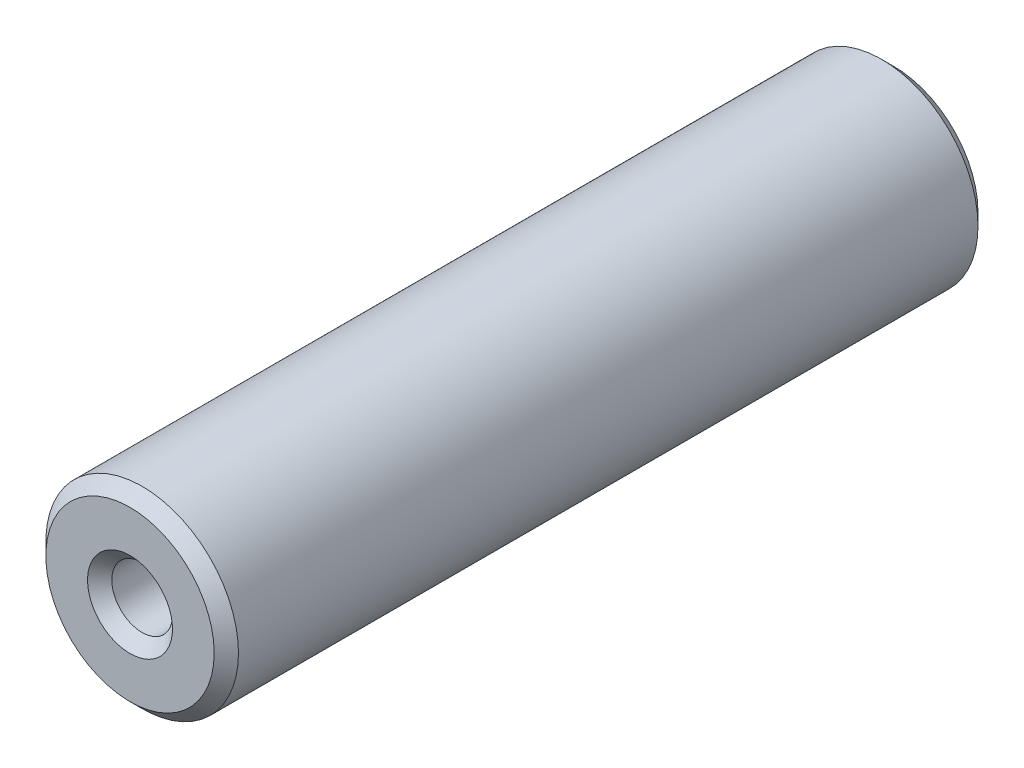
ISO-10303-21;
HEADER;
FILE_DESCRIPTION(('STEP AP214'),'2;1');
FILE_NAME('part.step','',(''),(''),'','','');
FILE_SCHEMA(('AUTOMOTIVE_DESIGN { 1 0 10303 214 1 1 1 1 }'));
ENDSEC;
DATA;
#1=APPLICATION_CONTEXT('core data for automotive mechanical design processes');
#2=APPLICATION_PROTOCOL_DEFINITION('international standard','automotive_design',2000,#1);
#3=PRODUCT_CONTEXT('',#1,'mechanical');
#4=PRODUCT('Part','Part','',(#3));
#5=PRODUCT_RELATED_PRODUCT_CATEGORY('part','',(#4));
#6=PRODUCT_DEFINITION_FORMATION('','',#4);
#7=PRODUCT_DEFINITION_CONTEXT('part definition',#1,'design');
#8=PRODUCT_DEFINITION('design','',#6,#7);
#9=PRODUCT_DEFINITION_SHAPE('','',#8);
#10=(LENGTH_UNIT() NAMED_UNIT(*) SI_UNIT(.MILLI.,.METRE.));
#11=(NAMED_UNIT(*) PLANE_ANGLE_UNIT() SI_UNIT($,.RADIAN.));
#12=(NAMED_UNIT(*) SI_UNIT($,.STERADIAN.) SOLID_ANGLE_UNIT());
#13=UNCERTAINTY_MEASURE_WITH_UNIT(LENGTH_MEASURE(1.E-05),#10,'distance_accuracy_value','');
#14=(GEOMETRIC_REPRESENTATION_CONTEXT(3) GLOBAL_UNCERTAINTY_ASSIGNED_CONTEXT((#13)) GLOBAL_UNIT_ASSIGNED_CONTEXT((#10,
#11,#12)) REPRESENTATION_CONTEXT('',''));
#15=CARTESIAN_POINT('',(0.,0.,0.));
#16=DIRECTION('',(0.,0.,1.));
#17=DIRECTION('',(1.,0.,0.));
#18=AXIS2_PLACEMENT_3D('',#15,#16,#17);
#19=CARTESIAN_POINT('',(0.,0.,31.475));
#20=DIRECTION('',(0.,0.,-1.));
#21=DIRECTION('',(-1.,0.,0.));
#22=AXIS2_PLACEMENT_3D('',#19,#20,#21);
#23=CYLINDRICAL_SURFACE('',#22,3.96875);
#24=CARTESIAN_POINT('',(0.,0.,0.500000000000004));
#25=DIRECTION('',(0.,0.,1.));
#26=DIRECTION('',(1.,0.,0.));
#27=AXIS2_PLACEMENT_3D('',#24,#25,#26);
#28=CIRCLE('',#27,3.96875);
#29=CARTESIAN_POINT('',(3.96875,0.,0.500000000000004));
#30=VERTEX_POINT('',#29);
#31=EDGE_CURVE('E45',#30,#30,#28,.T.);
#32=ORIENTED_EDGE('',*,*,#31,.T.);
#33=EDGE_LOOP('',(#32));
#34=FACE_BOUND('',#33,.T.);
#35=CARTESIAN_POINT('',(0.,0.,30.975));
#36=DIRECTION('',(0.,0.,1.));
#37=DIRECTION('',(1.,0.,0.));
#38=AXIS2_PLACEMENT_3D('',#35,#36,#37);
#39=CIRCLE('',#38,3.96875);
#40=CARTESIAN_POINT('',(3.96875,0.,30.975));
#41=VERTEX_POINT('',#40);
#42=EDGE_CURVE('E50',#41,#41,#39,.F.);
#43=ORIENTED_EDGE('',*,*,#42,.T.);
#44=EDGE_LOOP('',(#43));
#45=FACE_BOUND('',#44,.T.);
#46=ADVANCED_FACE('F30',(#34,#45),#23,.T.);
#47=CARTESIAN_POINT('',(0.,0.,31.475));
#48=DIRECTION('',(0.,0.,1.));
#49=DIRECTION('',(1.,0.,0.));
#50=AXIS2_PLACEMENT_3D('',#47,#48,#49);
#51=PLANE('',#50);
#52=CARTESIAN_POINT('',(0.,0.,31.475));
#53=DIRECTION('',(0.,0.,1.));
#54=DIRECTION('',(1.,0.,0.));
#55=AXIS2_PLACEMENT_3D('',#52,#53,#54);
#56=CIRCLE('',#55,3.46875000000001);
#57=CARTESIAN_POINT('',(3.46875000000001,0.,31.475));
#58=VERTEX_POINT('',#57);
#59=EDGE_CURVE('E37',#58,#58,#56,.T.);
#60=ORIENTED_EDGE('',*,*,#59,.T.);
#61=EDGE_LOOP('',(#60));
#62=FACE_BOUND('',#61,.T.);
#63=CARTESIAN_POINT('',(0.,0.,31.475));
#64=DIRECTION('',(0.,0.,1.));
#65=DIRECTION('',(1.,0.,0.));
#66=AXIS2_PLACEMENT_3D('',#63,#64,#65);
#67=CIRCLE('',#66,1.74999999999999);
#68=CARTESIAN_POINT('',(1.74999999999999,0.,31.475));
#69=VERTEX_POINT('',#68);
#70=EDGE_CURVE('E41',#69,#69,#67,.F.);
#71=ORIENTED_EDGE('',*,*,#70,.T.);
#72=EDGE_LOOP('',(#71));
#73=FACE_BOUND('',#72,.T.);
#74=ADVANCED_FACE('F88',(#62,#73),#51,.T.);
#75=CARTESIAN_POINT('',(0.,0.,0.));
#76=DIRECTION('',(0.,0.,1.));
#77=DIRECTION('',(1.,0.,0.));
#78=AXIS2_PLACEMENT_3D('',#75,#76,#77);
#79=PLANE('',#78);
#80=CARTESIAN_POINT('',(0.,0.,0.));
#81=DIRECTION('',(0.,0.,1.));
#82=DIRECTION('',(1.,0.,0.));
#83=AXIS2_PLACEMENT_3D('',#80,#81,#82);
#84=CIRCLE('',#83,1.85205841217279);
#85=CARTESIAN_POINT('',(1.85205841217279,0.,0.));
#86=VERTEX_POINT('',#85);
#87=EDGE_CURVE('E53',#86,#86,#84,.T.);
#88=ORIENTED_EDGE('',*,*,#87,.T.);
#89=EDGE_LOOP('',(#88));
#90=FACE_BOUND('',#89,.T.);
#91=CARTESIAN_POINT('',(0.,0.,0.));
#92=DIRECTION('',(0.,0.,1.));
#93=DIRECTION('',(1.,0.,0.));
#94=AXIS2_PLACEMENT_3D('',#91,#92,#93);
#95=CIRCLE('',#94,3.46874999999999);
#96=CARTESIAN_POINT('',(3.46874999999999,0.,0.));
#97=VERTEX_POINT('',#96);
#98=EDGE_CURVE('E56',#97,#97,#95,.F.);
#99=ORIENTED_EDGE('',*,*,#98,.T.);
#100=EDGE_LOOP('',(#99));
#101=FACE_BOUND('',#100,.T.);
#102=ADVANCED_FACE('F95',(#90,#101),#79,.F.);
#103=CARTESIAN_POINT('',(0.,0.,26.975));
#104=DIRECTION('',(0.,0.,1.));
#105=DIRECTION('',(1.,0.,0.));
#106=AXIS2_PLACEMENT_3D('',#103,#104,#105);
#107=CYLINDRICAL_SURFACE('',#106,1.25);
#108=CARTESIAN_POINT('',(0.,0.,30.975));
#109=DIRECTION('',(0.,0.,1.));
#110=DIRECTION('',(1.,0.,0.));
#111=AXIS2_PLACEMENT_3D('',#108,#109,#110);
#112=CIRCLE('',#111,1.25);
#113=CARTESIAN_POINT('',(1.25,0.,30.975));
#114=VERTEX_POINT('',#113);
#115=EDGE_CURVE('E10',#114,#114,#112,.T.);
#116=ORIENTED_EDGE('',*,*,#115,.T.);
#117=EDGE_LOOP('',(#116));
#118=FACE_BOUND('',#117,.T.);
#119=CARTESIAN_POINT('',(0.,0.,26.975));
#120=DIRECTION('',(0.,0.,1.));
#121=DIRECTION('',(1.,0.,0.));
#122=AXIS2_PLACEMENT_3D('',#119,#120,#121);
#123=CIRCLE('',#122,1.25);
#124=CARTESIAN_POINT('',(1.25,0.,26.975));
#125=VERTEX_POINT('',#124);
#126=EDGE_CURVE('E62',#125,#125,#123,.T.);
#127=ORIENTED_EDGE('',*,*,#126,.F.);
#128=EDGE_LOOP('',(#127));
#129=FACE_BOUND('',#128,.T.);
#130=ADVANCED_FACE('F84',(#118,#129),#107,.F.);
#131=CARTESIAN_POINT('',(0.,0.,26.975));
#132=DIRECTION('',(0.,0.,1.));
#133=DIRECTION('',(1.,0.,0.));
#134=AXIS2_PLACEMENT_3D('',#131,#132,#133);
#135=PLANE('',#134);
#136=ORIENTED_EDGE('',*,*,#126,.T.);
#137=EDGE_LOOP('',(#136));
#138=FACE_BOUND('',#137,.T.);
#139=ADVANCED_FACE('F73',(#138),#135,.T.);
#140=CARTESIAN_POINT('',(0.,0.,4.5));
#141=DIRECTION('',(0.,0.,-1.));
#142=DIRECTION('',(-1.,0.,0.));
#143=AXIS2_PLACEMENT_3D('',#140,#141,#142);
#144=CYLINDRICAL_SURFACE('',#143,1.35205841217278);
#145=CARTESIAN_POINT('',(0.,0.,0.50000000000001));
#146=DIRECTION('',(0.,0.,1.));
#147=DIRECTION('',(1.,0.,0.));
#148=AXIS2_PLACEMENT_3D('',#145,#146,#147);
#149=CIRCLE('',#148,1.35205841217278);
#150=CARTESIAN_POINT('',(1.35205841217278,0.,0.50000000000001));
#151=VERTEX_POINT('',#150);
#152=EDGE_CURVE('E59',#151,#151,#149,.F.);
#153=ORIENTED_EDGE('',*,*,#152,.T.);
#154=EDGE_LOOP('',(#153));
#155=FACE_BOUND('',#154,.T.);
#156=CARTESIAN_POINT('',(0.,0.,4.5));
#157=DIRECTION('',(0.,0.,-1.));
#158=DIRECTION('',(-1.,0.,0.));
#159=AXIS2_PLACEMENT_3D('',#156,#157,#158);
#160=CIRCLE('',#159,1.35205841217278);
#161=CARTESIAN_POINT('',(-1.35205841217278,0.,4.5));
#162=VERTEX_POINT('',#161);
#163=EDGE_CURVE('E65',#162,#162,#160,.T.);
#164=ORIENTED_EDGE('',*,*,#163,.F.);
#165=EDGE_LOOP('',(#164));
#166=FACE_BOUND('',#165,.T.);
#167=ADVANCED_FACE('F71',(#155,#166),#144,.F.);
#168=CARTESIAN_POINT('',(0.,0.,4.5));
#169=DIRECTION('',(0.,0.,-1.));
#170=DIRECTION('',(-1.,0.,0.));
#171=AXIS2_PLACEMENT_3D('',#168,#169,#170);
#172=PLANE('',#171);
#173=ORIENTED_EDGE('',*,*,#163,.T.);
#174=EDGE_LOOP('',(#173));
#175=FACE_BOUND('',#174,.T.);
#176=ADVANCED_FACE('F69',(#175),#172,.T.);
#177=CARTESIAN_POINT('',(0.,0.,0.50000000000001));
#178=DIRECTION('',(0.,0.,-1.));
#179=DIRECTION('',(-1.,0.,0.));
#180=AXIS2_PLACEMENT_3D('',#177,#178,#179);
#181=CONICAL_SURFACE('',#180,1.35205841217278,0.78539816339745);
#182=ORIENTED_EDGE('',*,*,#87,.F.);
#183=EDGE_LOOP('',(#182));
#184=FACE_BOUND('',#183,.T.);
#185=ORIENTED_EDGE('',*,*,#152,.F.);
#186=EDGE_LOOP('',(#185));
#187=FACE_BOUND('',#186,.T.);
#188=ADVANCED_FACE('F81',(#184,#187),#181,.F.);
#189=CARTESIAN_POINT('',(0.,0.,0.500000000000004));
#190=DIRECTION('',(0.,0.,1.));
#191=DIRECTION('',(1.,0.,0.));
#192=AXIS2_PLACEMENT_3D('',#189,#190,#191);
#193=CONICAL_SURFACE('',#192,3.96875,0.785398163397452);
#194=ORIENTED_EDGE('',*,*,#98,.F.);
#195=EDGE_LOOP('',(#194));
#196=FACE_BOUND('',#195,.T.);
#197=ORIENTED_EDGE('',*,*,#31,.F.);
#198=EDGE_LOOP('',(#197));
#199=FACE_BOUND('',#198,.T.);
#200=ADVANCED_FACE('F102',(#196,#199),#193,.T.);
#201=CARTESIAN_POINT('',(0.,0.,31.475));
#202=DIRECTION('',(0.,0.,-1.));
#203=DIRECTION('',(-1.,0.,0.));
#204=AXIS2_PLACEMENT_3D('',#201,#202,#203);
#205=CONICAL_SURFACE('',#204,3.46875000000001,0.785398163397448);
#206=ORIENTED_EDGE('',*,*,#42,.F.);
#207=EDGE_LOOP('',(#206));
#208=FACE_BOUND('',#207,.T.);
#209=ORIENTED_EDGE('',*,*,#59,.F.);
#210=EDGE_LOOP('',(#209));
#211=FACE_BOUND('',#210,.T.);
#212=ADVANCED_FACE('F105',(#208,#211),#205,.T.);
#213=CARTESIAN_POINT('',(0.,0.,30.975));
#214=DIRECTION('',(0.,0.,1.));
#215=DIRECTION('',(1.,0.,0.));
#216=AXIS2_PLACEMENT_3D('',#213,#214,#215);
#217=CONICAL_SURFACE('',#216,1.25,0.785398163397446);
#218=ORIENTED_EDGE('',*,*,#70,.F.);
#219=EDGE_LOOP('',(#218));
#220=FACE_BOUND('',#219,.T.);
#221=ORIENTED_EDGE('',*,*,#115,.F.);
#222=EDGE_LOOP('',(#221));
#223=FACE_BOUND('',#222,.T.);
#224=ADVANCED_FACE('F32',(#220,#223),#217,.F.);
#225=CLOSED_SHELL('',(#46,#74,#102,#130,#139,#167,#176,#188,#200,#212,#224));
#226=MANIFOLD_SOLID_BREP('B2',#225);
#227=ADVANCED_BREP_SHAPE_REPRESENTATION('',(#18,#226),#14);
#228=SHAPE_DEFINITION_REPRESENTATION(#9,#227);
ENDSEC;
END-ISO-10303-21;
